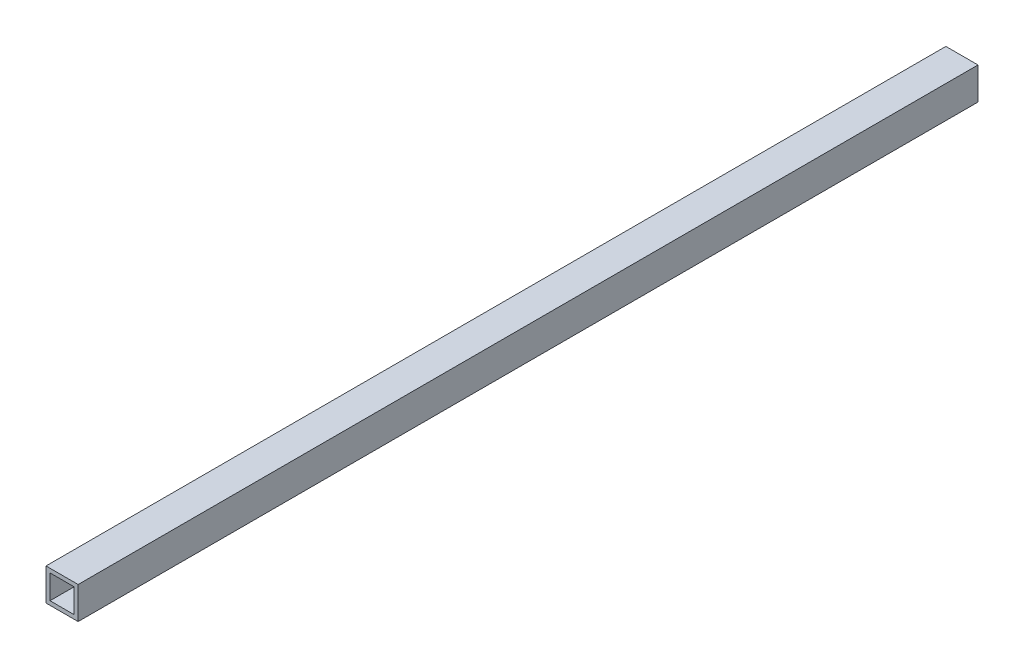
ISO-10303-21;
HEADER;
FILE_DESCRIPTION(('STEP AP214'),'2;1');
FILE_NAME('part.step','',(''),(''),'','','');
FILE_SCHEMA(('AUTOMOTIVE_DESIGN { 1 0 10303 214 1 1 1 1 }'));
ENDSEC;
DATA;
#1=APPLICATION_CONTEXT('core data for automotive mechanical design processes');
#2=APPLICATION_PROTOCOL_DEFINITION('international standard','automotive_design',2000,#1);
#3=PRODUCT_CONTEXT('',#1,'mechanical');
#4=PRODUCT('Part','Part','',(#3));
#5=PRODUCT_RELATED_PRODUCT_CATEGORY('part','',(#4));
#6=PRODUCT_DEFINITION_FORMATION('','',#4);
#7=PRODUCT_DEFINITION_CONTEXT('part definition',#1,'design');
#8=PRODUCT_DEFINITION('design','',#6,#7);
#9=PRODUCT_DEFINITION_SHAPE('','',#8);
#10=(LENGTH_UNIT() NAMED_UNIT(*) SI_UNIT(.MILLI.,.METRE.));
#11=(NAMED_UNIT(*) PLANE_ANGLE_UNIT() SI_UNIT($,.RADIAN.));
#12=(NAMED_UNIT(*) SI_UNIT($,.STERADIAN.) SOLID_ANGLE_UNIT());
#13=UNCERTAINTY_MEASURE_WITH_UNIT(LENGTH_MEASURE(1.E-05),#10,'distance_accuracy_value','');
#14=(GEOMETRIC_REPRESENTATION_CONTEXT(3) GLOBAL_UNCERTAINTY_ASSIGNED_CONTEXT((#13)) GLOBAL_UNIT_ASSIGNED_CONTEXT((#10,
#11,#12)) REPRESENTATION_CONTEXT('',''));
#15=CARTESIAN_POINT('',(0.,0.,0.));
#16=DIRECTION('',(0.,0.,1.));
#17=DIRECTION('',(1.,0.,0.));
#18=AXIS2_PLACEMENT_3D('',#15,#16,#17);
#19=CARTESIAN_POINT('',(0.,0.,355.6));
#20=DIRECTION('',(0.,0.,-1.));
#21=DIRECTION('',(-1.,0.,0.));
#22=AXIS2_PLACEMENT_3D('',#19,#20,#21);
#23=PLANE('',#22);
#24=DIRECTION('',(0.,1.,0.));
#25=VECTOR('',#24,1.);
#26=CARTESIAN_POINT('',(342.9,92.075,355.6));
#27=LINE('',#26,#25);
#28=CARTESIAN_POINT('',(342.9,66.675,355.6));
#29=VERTEX_POINT('',#28);
#30=CARTESIAN_POINT('',(342.9,92.075,355.6));
#31=VERTEX_POINT('',#30);
#32=EDGE_CURVE('E111',#29,#31,#27,.T.);
#33=ORIENTED_EDGE('',*,*,#32,.T.);
#34=DIRECTION('',(-1.,0.,0.));
#35=VECTOR('',#34,1.);
#36=CARTESIAN_POINT('',(342.9,92.075,355.6));
#37=LINE('',#36,#35);
#38=CARTESIAN_POINT('',(317.5,92.075,355.6));
#39=VERTEX_POINT('',#38);
#40=EDGE_CURVE('E154',#31,#39,#37,.T.);
#41=ORIENTED_EDGE('',*,*,#40,.T.);
#42=DIRECTION('',(0.,-1.,0.));
#43=VECTOR('',#42,1.);
#44=CARTESIAN_POINT('',(317.5,92.075,355.6));
#45=LINE('',#44,#43);
#46=CARTESIAN_POINT('',(317.5,66.675,355.6));
#47=VERTEX_POINT('',#46);
#48=EDGE_CURVE('E156',#39,#47,#45,.T.);
#49=ORIENTED_EDGE('',*,*,#48,.T.);
#50=DIRECTION('',(1.,0.,0.));
#51=VECTOR('',#50,1.);
#52=CARTESIAN_POINT('',(342.9,66.675,355.6));
#53=LINE('',#52,#51);
#54=EDGE_CURVE('E58',#47,#29,#53,.T.);
#55=ORIENTED_EDGE('',*,*,#54,.T.);
#56=EDGE_LOOP('',(#33,#41,#49,#55));
#57=FACE_BOUND('',#56,.T.);
#58=DIRECTION('',(0.,1.,0.));
#59=VECTOR('',#58,1.);
#60=CARTESIAN_POINT('',(339.725,88.9,355.6));
#61=LINE('',#60,#59);
#62=CARTESIAN_POINT('',(339.725,69.85,355.6));
#63=VERTEX_POINT('',#62);
#64=CARTESIAN_POINT('',(339.725,88.9,355.6));
#65=VERTEX_POINT('',#64);
#66=EDGE_CURVE('E108',#63,#65,#61,.T.);
#67=ORIENTED_EDGE('',*,*,#66,.F.);
#68=DIRECTION('',(1.,0.,0.));
#69=VECTOR('',#68,1.);
#70=CARTESIAN_POINT('',(339.725,69.85,355.6));
#71=LINE('',#70,#69);
#72=CARTESIAN_POINT('',(320.675,69.85,355.6));
#73=VERTEX_POINT('',#72);
#74=EDGE_CURVE('E147',#73,#63,#71,.T.);
#75=ORIENTED_EDGE('',*,*,#74,.F.);
#76=DIRECTION('',(0.,-1.,0.));
#77=VECTOR('',#76,1.);
#78=CARTESIAN_POINT('',(320.675,88.9,355.6));
#79=LINE('',#78,#77);
#80=CARTESIAN_POINT('',(320.675,88.9,355.6));
#81=VERTEX_POINT('',#80);
#82=EDGE_CURVE('E145',#81,#73,#79,.T.);
#83=ORIENTED_EDGE('',*,*,#82,.F.);
#84=DIRECTION('',(-1.,0.,0.));
#85=VECTOR('',#84,1.);
#86=CARTESIAN_POINT('',(339.725,88.9,355.6));
#87=LINE('',#86,#85);
#88=EDGE_CURVE('E143',#65,#81,#87,.T.);
#89=ORIENTED_EDGE('',*,*,#88,.F.);
#90=EDGE_LOOP('',(#67,#75,#83,#89));
#91=FACE_BOUND('',#90,.T.);
#92=ADVANCED_FACE('F35',(#57,#91),#23,.F.);
#93=CARTESIAN_POINT('',(342.9,92.075,355.6));
#94=DIRECTION('',(-1.,0.,0.));
#95=DIRECTION('',(0.,0.,1.));
#96=AXIS2_PLACEMENT_3D('',#93,#94,#95);
#97=PLANE('',#96);
#98=DIRECTION('',(0.,0.,-1.));
#99=VECTOR('',#98,1.);
#100=CARTESIAN_POINT('',(342.9,66.675,355.6));
#101=LINE('',#100,#99);
#102=CARTESIAN_POINT('',(342.9,66.675,-355.6));
#103=VERTEX_POINT('',#102);
#104=EDGE_CURVE('E159',#29,#103,#101,.T.);
#105=ORIENTED_EDGE('',*,*,#104,.T.);
#106=DIRECTION('',(0.,1.,0.));
#107=VECTOR('',#106,1.);
#108=CARTESIAN_POINT('',(342.9,92.075,-355.6));
#109=LINE('',#108,#107);
#110=CARTESIAN_POINT('',(342.9,92.075,-355.6));
#111=VERTEX_POINT('',#110);
#112=EDGE_CURVE('E130',#103,#111,#109,.T.);
#113=ORIENTED_EDGE('',*,*,#112,.T.);
#114=DIRECTION('',(0.,0.,-1.));
#115=VECTOR('',#114,1.);
#116=CARTESIAN_POINT('',(342.9,92.075,355.6));
#117=LINE('',#116,#115);
#118=EDGE_CURVE('E11',#31,#111,#117,.T.);
#119=ORIENTED_EDGE('',*,*,#118,.F.);
#120=ORIENTED_EDGE('',*,*,#32,.F.);
#121=EDGE_LOOP('',(#105,#113,#119,#120));
#122=FACE_BOUND('',#121,.T.);
#123=ADVANCED_FACE('F37',(#122),#97,.F.);
#124=CARTESIAN_POINT('',(342.9,92.075,355.6));
#125=DIRECTION('',(0.,-1.,0.));
#126=DIRECTION('',(0.,0.,-1.));
#127=AXIS2_PLACEMENT_3D('',#124,#125,#126);
#128=PLANE('',#127);
#129=ORIENTED_EDGE('',*,*,#118,.T.);
#130=DIRECTION('',(-1.,0.,0.));
#131=VECTOR('',#130,1.);
#132=CARTESIAN_POINT('',(342.9,92.075,-355.6));
#133=LINE('',#132,#131);
#134=CARTESIAN_POINT('',(317.5,92.075,-355.6));
#135=VERTEX_POINT('',#134);
#136=EDGE_CURVE('E133',#111,#135,#133,.T.);
#137=ORIENTED_EDGE('',*,*,#136,.T.);
#138=DIRECTION('',(0.,0.,-1.));
#139=VECTOR('',#138,1.);
#140=CARTESIAN_POINT('',(317.5,92.075,355.6));
#141=LINE('',#140,#139);
#142=EDGE_CURVE('E43',#39,#135,#141,.T.);
#143=ORIENTED_EDGE('',*,*,#142,.F.);
#144=ORIENTED_EDGE('',*,*,#40,.F.);
#145=EDGE_LOOP('',(#129,#137,#143,#144));
#146=FACE_BOUND('',#145,.T.);
#147=ADVANCED_FACE('F172',(#146),#128,.F.);
#148=CARTESIAN_POINT('',(317.5,92.075,355.6));
#149=DIRECTION('',(1.,0.,0.));
#150=DIRECTION('',(0.,0.,-1.));
#151=AXIS2_PLACEMENT_3D('',#148,#149,#150);
#152=PLANE('',#151);
#153=ORIENTED_EDGE('',*,*,#142,.T.);
#154=DIRECTION('',(0.,-1.,0.));
#155=VECTOR('',#154,1.);
#156=CARTESIAN_POINT('',(317.5,92.075,-355.6));
#157=LINE('',#156,#155);
#158=CARTESIAN_POINT('',(317.5,66.675,-355.6));
#159=VERTEX_POINT('',#158);
#160=EDGE_CURVE('E136',#135,#159,#157,.T.);
#161=ORIENTED_EDGE('',*,*,#160,.T.);
#162=DIRECTION('',(0.,0.,-1.));
#163=VECTOR('',#162,1.);
#164=CARTESIAN_POINT('',(317.5,66.675,355.6));
#165=LINE('',#164,#163);
#166=EDGE_CURVE('E161',#47,#159,#165,.T.);
#167=ORIENTED_EDGE('',*,*,#166,.F.);
#168=ORIENTED_EDGE('',*,*,#48,.F.);
#169=EDGE_LOOP('',(#153,#161,#167,#168));
#170=FACE_BOUND('',#169,.T.);
#171=ADVANCED_FACE('F166',(#170),#152,.F.);
#172=CARTESIAN_POINT('',(342.9,66.675,355.6));
#173=DIRECTION('',(0.,1.,0.));
#174=DIRECTION('',(0.,0.,1.));
#175=AXIS2_PLACEMENT_3D('',#172,#173,#174);
#176=PLANE('',#175);
#177=ORIENTED_EDGE('',*,*,#166,.T.);
#178=DIRECTION('',(1.,0.,0.));
#179=VECTOR('',#178,1.);
#180=CARTESIAN_POINT('',(342.9,66.675,-355.6));
#181=LINE('',#180,#179);
#182=EDGE_CURVE('E139',#159,#103,#181,.T.);
#183=ORIENTED_EDGE('',*,*,#182,.T.);
#184=ORIENTED_EDGE('',*,*,#104,.F.);
#185=ORIENTED_EDGE('',*,*,#54,.F.);
#186=EDGE_LOOP('',(#177,#183,#184,#185));
#187=FACE_BOUND('',#186,.T.);
#188=ADVANCED_FACE('F177',(#187),#176,.F.);
#189=CARTESIAN_POINT('',(339.725,88.9,355.6));
#190=DIRECTION('',(-1.,0.,0.));
#191=DIRECTION('',(0.,0.,1.));
#192=AXIS2_PLACEMENT_3D('',#189,#190,#191);
#193=PLANE('',#192);
#194=DIRECTION('',(0.,0.,-1.));
#195=VECTOR('',#194,1.);
#196=CARTESIAN_POINT('',(339.725,88.9,355.6));
#197=LINE('',#196,#195);
#198=CARTESIAN_POINT('',(339.725,88.9,-355.6));
#199=VERTEX_POINT('',#198);
#200=EDGE_CURVE('E100',#65,#199,#197,.T.);
#201=ORIENTED_EDGE('',*,*,#200,.T.);
#202=DIRECTION('',(0.,1.,0.));
#203=VECTOR('',#202,1.);
#204=CARTESIAN_POINT('',(339.725,88.9,-355.6));
#205=LINE('',#204,#203);
#206=CARTESIAN_POINT('',(339.725,69.85,-355.6));
#207=VERTEX_POINT('',#206);
#208=EDGE_CURVE('E105',#207,#199,#205,.T.);
#209=ORIENTED_EDGE('',*,*,#208,.F.);
#210=DIRECTION('',(0.,0.,-1.));
#211=VECTOR('',#210,1.);
#212=CARTESIAN_POINT('',(339.725,69.85,355.6));
#213=LINE('',#212,#211);
#214=EDGE_CURVE('E149',#63,#207,#213,.T.);
#215=ORIENTED_EDGE('',*,*,#214,.F.);
#216=ORIENTED_EDGE('',*,*,#66,.T.);
#217=EDGE_LOOP('',(#201,#209,#215,#216));
#218=FACE_BOUND('',#217,.T.);
#219=ADVANCED_FACE('F102',(#218),#193,.T.);
#220=CARTESIAN_POINT('',(339.725,88.9,355.6));
#221=DIRECTION('',(0.,-1.,0.));
#222=DIRECTION('',(0.,0.,-1.));
#223=AXIS2_PLACEMENT_3D('',#220,#221,#222);
#224=PLANE('',#223);
#225=DIRECTION('',(0.,0.,-1.));
#226=VECTOR('',#225,1.);
#227=CARTESIAN_POINT('',(320.675,88.9,355.6));
#228=LINE('',#227,#226);
#229=CARTESIAN_POINT('',(320.675,88.9,-355.6));
#230=VERTEX_POINT('',#229);
#231=EDGE_CURVE('E112',#81,#230,#228,.T.);
#232=ORIENTED_EDGE('',*,*,#231,.T.);
#233=DIRECTION('',(-1.,0.,0.));
#234=VECTOR('',#233,1.);
#235=CARTESIAN_POINT('',(339.725,88.9,-355.6));
#236=LINE('',#235,#234);
#237=EDGE_CURVE('E115',#199,#230,#236,.T.);
#238=ORIENTED_EDGE('',*,*,#237,.F.);
#239=ORIENTED_EDGE('',*,*,#200,.F.);
#240=ORIENTED_EDGE('',*,*,#88,.T.);
#241=EDGE_LOOP('',(#232,#238,#239,#240));
#242=FACE_BOUND('',#241,.T.);
#243=ADVANCED_FACE('F116',(#242),#224,.T.);
#244=CARTESIAN_POINT('',(320.675,88.9,355.6));
#245=DIRECTION('',(1.,0.,0.));
#246=DIRECTION('',(0.,0.,-1.));
#247=AXIS2_PLACEMENT_3D('',#244,#245,#246);
#248=PLANE('',#247);
#249=DIRECTION('',(0.,0.,-1.));
#250=VECTOR('',#249,1.);
#251=CARTESIAN_POINT('',(320.675,69.85,355.6));
#252=LINE('',#251,#250);
#253=CARTESIAN_POINT('',(320.675,69.85,-355.6));
#254=VERTEX_POINT('',#253);
#255=EDGE_CURVE('E50',#73,#254,#252,.T.);
#256=ORIENTED_EDGE('',*,*,#255,.T.);
#257=DIRECTION('',(0.,-1.,0.));
#258=VECTOR('',#257,1.);
#259=CARTESIAN_POINT('',(320.675,88.9,-355.6));
#260=LINE('',#259,#258);
#261=EDGE_CURVE('E121',#230,#254,#260,.T.);
#262=ORIENTED_EDGE('',*,*,#261,.F.);
#263=ORIENTED_EDGE('',*,*,#231,.F.);
#264=ORIENTED_EDGE('',*,*,#82,.T.);
#265=EDGE_LOOP('',(#256,#262,#263,#264));
#266=FACE_BOUND('',#265,.T.);
#267=ADVANCED_FACE('F195',(#266),#248,.T.);
#268=CARTESIAN_POINT('',(339.725,69.85,355.6));
#269=DIRECTION('',(0.,1.,0.));
#270=DIRECTION('',(0.,0.,1.));
#271=AXIS2_PLACEMENT_3D('',#268,#269,#270);
#272=PLANE('',#271);
#273=ORIENTED_EDGE('',*,*,#214,.T.);
#274=DIRECTION('',(1.,0.,0.));
#275=VECTOR('',#274,1.);
#276=CARTESIAN_POINT('',(339.725,69.85,-355.6));
#277=LINE('',#276,#275);
#278=EDGE_CURVE('E125',#254,#207,#277,.T.);
#279=ORIENTED_EDGE('',*,*,#278,.F.);
#280=ORIENTED_EDGE('',*,*,#255,.F.);
#281=ORIENTED_EDGE('',*,*,#74,.T.);
#282=EDGE_LOOP('',(#273,#279,#280,#281));
#283=FACE_BOUND('',#282,.T.);
#284=ADVANCED_FACE('F198',(#283),#272,.T.);
#285=CARTESIAN_POINT('',(0.,0.,-355.6));
#286=DIRECTION('',(0.,0.,-1.));
#287=DIRECTION('',(-1.,0.,0.));
#288=AXIS2_PLACEMENT_3D('',#285,#286,#287);
#289=PLANE('',#288);
#290=ORIENTED_EDGE('',*,*,#208,.T.);
#291=ORIENTED_EDGE('',*,*,#237,.T.);
#292=ORIENTED_EDGE('',*,*,#261,.T.);
#293=ORIENTED_EDGE('',*,*,#278,.T.);
#294=EDGE_LOOP('',(#290,#291,#292,#293));
#295=FACE_BOUND('',#294,.T.);
#296=ORIENTED_EDGE('',*,*,#112,.F.);
#297=ORIENTED_EDGE('',*,*,#182,.F.);
#298=ORIENTED_EDGE('',*,*,#160,.F.);
#299=ORIENTED_EDGE('',*,*,#136,.F.);
#300=EDGE_LOOP('',(#296,#297,#298,#299));
#301=FACE_BOUND('',#300,.T.);
#302=ADVANCED_FACE('F123',(#295,#301),#289,.T.);
#303=CLOSED_SHELL('',(#92,#123,#147,#171,#188,#219,#243,#267,#284,#302));
#304=MANIFOLD_SOLID_BREP('B2',#303);
#305=ADVANCED_BREP_SHAPE_REPRESENTATION('',(#18,#304),#14);
#306=SHAPE_DEFINITION_REPRESENTATION(#9,#305);
ENDSEC;
END-ISO-10303-21;
